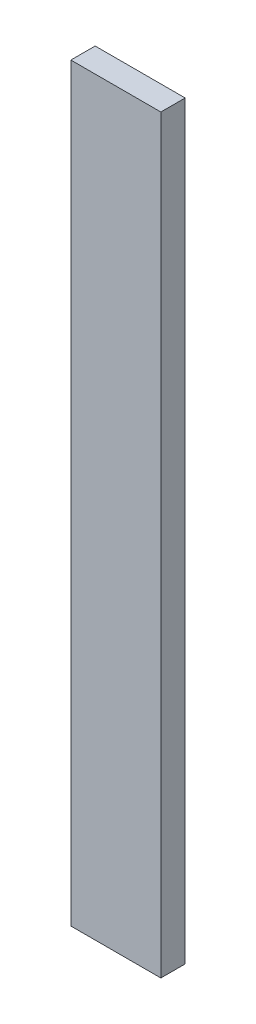
ISO-10303-21;
HEADER;
FILE_DESCRIPTION(('STEP AP214'),'2;1');
FILE_NAME('part.step','',(''),(''),'','','');
FILE_SCHEMA(('AUTOMOTIVE_DESIGN { 1 0 10303 214 1 1 1 1 }'));
ENDSEC;
DATA;
#1=APPLICATION_CONTEXT('core data for automotive mechanical design processes');
#2=APPLICATION_PROTOCOL_DEFINITION('international standard','automotive_design',2000,#1);
#3=PRODUCT_CONTEXT('',#1,'mechanical');
#4=PRODUCT('Part','Part','',(#3));
#5=PRODUCT_RELATED_PRODUCT_CATEGORY('part','',(#4));
#6=PRODUCT_DEFINITION_FORMATION('','',#4);
#7=PRODUCT_DEFINITION_CONTEXT('part definition',#1,'design');
#8=PRODUCT_DEFINITION('design','',#6,#7);
#9=PRODUCT_DEFINITION_SHAPE('','',#8);
#10=(LENGTH_UNIT() NAMED_UNIT(*) SI_UNIT(.MILLI.,.METRE.));
#11=(NAMED_UNIT(*) PLANE_ANGLE_UNIT() SI_UNIT($,.RADIAN.));
#12=(NAMED_UNIT(*) SI_UNIT($,.STERADIAN.) SOLID_ANGLE_UNIT());
#13=UNCERTAINTY_MEASURE_WITH_UNIT(LENGTH_MEASURE(1.E-05),#10,'distance_accuracy_value','');
#14=(GEOMETRIC_REPRESENTATION_CONTEXT(3) GLOBAL_UNCERTAINTY_ASSIGNED_CONTEXT((#13)) GLOBAL_UNIT_ASSIGNED_CONTEXT((#10,
#11,#12)) REPRESENTATION_CONTEXT('',''));
#15=CARTESIAN_POINT('',(0.,0.,0.));
#16=DIRECTION('',(0.,0.,1.));
#17=DIRECTION('',(1.,0.,0.));
#18=AXIS2_PLACEMENT_3D('',#15,#16,#17);
#19=CARTESIAN_POINT('',(0.,0.,8.1));
#20=DIRECTION('',(1.,0.,0.));
#21=DIRECTION('',(0.,0.,-1.));
#22=AXIS2_PLACEMENT_3D('',#19,#20,#21);
#23=PLANE('',#22);
#24=DIRECTION('',(0.,-1.,0.));
#25=VECTOR('',#24,1.);
#26=CARTESIAN_POINT('',(0.,0.,0.));
#27=LINE('',#26,#25);
#28=CARTESIAN_POINT('',(0.,250.,0.));
#29=VERTEX_POINT('',#28);
#30=CARTESIAN_POINT('',(0.,0.,0.));
#31=VERTEX_POINT('',#30);
#32=EDGE_CURVE('E96',#29,#31,#27,.T.);
#33=ORIENTED_EDGE('',*,*,#32,.T.);
#34=DIRECTION('',(0.,0.,-1.));
#35=VECTOR('',#34,1.);
#36=CARTESIAN_POINT('',(0.,0.,8.1));
#37=LINE('',#36,#35);
#38=CARTESIAN_POINT('',(0.,0.,8.1));
#39=VERTEX_POINT('',#38);
#40=EDGE_CURVE('E11',#39,#31,#37,.T.);
#41=ORIENTED_EDGE('',*,*,#40,.F.);
#42=DIRECTION('',(0.,-1.,0.));
#43=VECTOR('',#42,1.);
#44=CARTESIAN_POINT('',(0.,0.,8.1));
#45=LINE('',#44,#43);
#46=CARTESIAN_POINT('',(0.,250.,8.1));
#47=VERTEX_POINT('',#46);
#48=EDGE_CURVE('E84',#47,#39,#45,.T.);
#49=ORIENTED_EDGE('',*,*,#48,.F.);
#50=DIRECTION('',(0.,0.,-1.));
#51=VECTOR('',#50,1.);
#52=CARTESIAN_POINT('',(0.,250.,8.1));
#53=LINE('',#52,#51);
#54=EDGE_CURVE('E92',#47,#29,#53,.T.);
#55=ORIENTED_EDGE('',*,*,#54,.T.);
#56=EDGE_LOOP('',(#33,#41,#49,#55));
#57=FACE_BOUND('',#56,.T.);
#58=ADVANCED_FACE('F33',(#57),#23,.F.);
#59=CARTESIAN_POINT('',(0.,0.,8.1));
#60=DIRECTION('',(0.,1.,0.));
#61=DIRECTION('',(0.,0.,1.));
#62=AXIS2_PLACEMENT_3D('',#59,#60,#61);
#63=PLANE('',#62);
#64=DIRECTION('',(1.,0.,0.));
#65=VECTOR('',#64,1.);
#66=CARTESIAN_POINT('',(0.,0.,0.));
#67=LINE('',#66,#65);
#68=CARTESIAN_POINT('',(30.,0.,0.));
#69=VERTEX_POINT('',#68);
#70=EDGE_CURVE('E88',#31,#69,#67,.T.);
#71=ORIENTED_EDGE('',*,*,#70,.T.);
#72=DIRECTION('',(0.,0.,-1.));
#73=VECTOR('',#72,1.);
#74=CARTESIAN_POINT('',(30.,0.,8.1));
#75=LINE('',#74,#73);
#76=CARTESIAN_POINT('',(30.,0.,8.1));
#77=VERTEX_POINT('',#76);
#78=EDGE_CURVE('E41',#77,#69,#75,.T.);
#79=ORIENTED_EDGE('',*,*,#78,.F.);
#80=DIRECTION('',(1.,0.,0.));
#81=VECTOR('',#80,1.);
#82=CARTESIAN_POINT('',(0.,0.,8.1));
#83=LINE('',#82,#81);
#84=EDGE_CURVE('E79',#39,#77,#83,.T.);
#85=ORIENTED_EDGE('',*,*,#84,.F.);
#86=ORIENTED_EDGE('',*,*,#40,.T.);
#87=EDGE_LOOP('',(#71,#79,#85,#86));
#88=FACE_BOUND('',#87,.T.);
#89=ADVANCED_FACE('F87',(#88),#63,.F.);
#90=CARTESIAN_POINT('',(30.,0.,8.1));
#91=DIRECTION('',(-1.,0.,0.));
#92=DIRECTION('',(0.,0.,1.));
#93=AXIS2_PLACEMENT_3D('',#90,#91,#92);
#94=PLANE('',#93);
#95=DIRECTION('',(0.,1.,0.));
#96=VECTOR('',#95,1.);
#97=CARTESIAN_POINT('',(30.,0.,0.));
#98=LINE('',#97,#96);
#99=CARTESIAN_POINT('',(30.,250.,0.));
#100=VERTEX_POINT('',#99);
#101=EDGE_CURVE('E66',#69,#100,#98,.T.);
#102=ORIENTED_EDGE('',*,*,#101,.T.);
#103=DIRECTION('',(0.,0.,-1.));
#104=VECTOR('',#103,1.);
#105=CARTESIAN_POINT('',(30.,250.,8.1));
#106=LINE('',#105,#104);
#107=CARTESIAN_POINT('',(30.,250.,8.1));
#108=VERTEX_POINT('',#107);
#109=EDGE_CURVE('E89',#108,#100,#106,.T.);
#110=ORIENTED_EDGE('',*,*,#109,.F.);
#111=DIRECTION('',(0.,1.,0.));
#112=VECTOR('',#111,1.);
#113=CARTESIAN_POINT('',(30.,0.,8.1));
#114=LINE('',#113,#112);
#115=EDGE_CURVE('E82',#77,#108,#114,.T.);
#116=ORIENTED_EDGE('',*,*,#115,.F.);
#117=ORIENTED_EDGE('',*,*,#78,.T.);
#118=EDGE_LOOP('',(#102,#110,#116,#117));
#119=FACE_BOUND('',#118,.T.);
#120=ADVANCED_FACE('F90',(#119),#94,.F.);
#121=CARTESIAN_POINT('',(0.,250.,8.1));
#122=DIRECTION('',(0.,-1.,0.));
#123=DIRECTION('',(0.,0.,-1.));
#124=AXIS2_PLACEMENT_3D('',#121,#122,#123);
#125=PLANE('',#124);
#126=DIRECTION('',(-1.,0.,0.));
#127=VECTOR('',#126,1.);
#128=CARTESIAN_POINT('',(0.,250.,0.));
#129=LINE('',#128,#127);
#130=EDGE_CURVE('E72',#100,#29,#129,.T.);
#131=ORIENTED_EDGE('',*,*,#130,.T.);
#132=ORIENTED_EDGE('',*,*,#54,.F.);
#133=DIRECTION('',(-1.,0.,0.));
#134=VECTOR('',#133,1.);
#135=CARTESIAN_POINT('',(0.,250.,8.1));
#136=LINE('',#135,#134);
#137=EDGE_CURVE('E49',#108,#47,#136,.T.);
#138=ORIENTED_EDGE('',*,*,#137,.F.);
#139=ORIENTED_EDGE('',*,*,#109,.T.);
#140=EDGE_LOOP('',(#131,#132,#138,#139));
#141=FACE_BOUND('',#140,.T.);
#142=ADVANCED_FACE('F103',(#141),#125,.F.);
#143=CARTESIAN_POINT('',(0.,0.,8.1));
#144=DIRECTION('',(0.,0.,-1.));
#145=DIRECTION('',(-1.,0.,0.));
#146=AXIS2_PLACEMENT_3D('',#143,#144,#145);
#147=PLANE('',#146);
#148=ORIENTED_EDGE('',*,*,#48,.T.);
#149=ORIENTED_EDGE('',*,*,#84,.T.);
#150=ORIENTED_EDGE('',*,*,#115,.T.);
#151=ORIENTED_EDGE('',*,*,#137,.T.);
#152=EDGE_LOOP('',(#148,#149,#150,#151));
#153=FACE_BOUND('',#152,.T.);
#154=ADVANCED_FACE('F80',(#153),#147,.F.);
#155=CARTESIAN_POINT('',(0.,0.,0.));
#156=DIRECTION('',(0.,0.,-1.));
#157=DIRECTION('',(-1.,0.,0.));
#158=AXIS2_PLACEMENT_3D('',#155,#156,#157);
#159=PLANE('',#158);
#160=ORIENTED_EDGE('',*,*,#32,.F.);
#161=ORIENTED_EDGE('',*,*,#130,.F.);
#162=ORIENTED_EDGE('',*,*,#101,.F.);
#163=ORIENTED_EDGE('',*,*,#70,.F.);
#164=EDGE_LOOP('',(#160,#161,#162,#163));
#165=FACE_BOUND('',#164,.T.);
#166=ADVANCED_FACE('F106',(#165),#159,.T.);
#167=CLOSED_SHELL('',(#58,#89,#120,#142,#154,#166));
#168=MANIFOLD_SOLID_BREP('B2',#167);
#169=ADVANCED_BREP_SHAPE_REPRESENTATION('',(#18,#168),#14);
#170=SHAPE_DEFINITION_REPRESENTATION(#9,#169);
ENDSEC;
END-ISO-10303-21;
